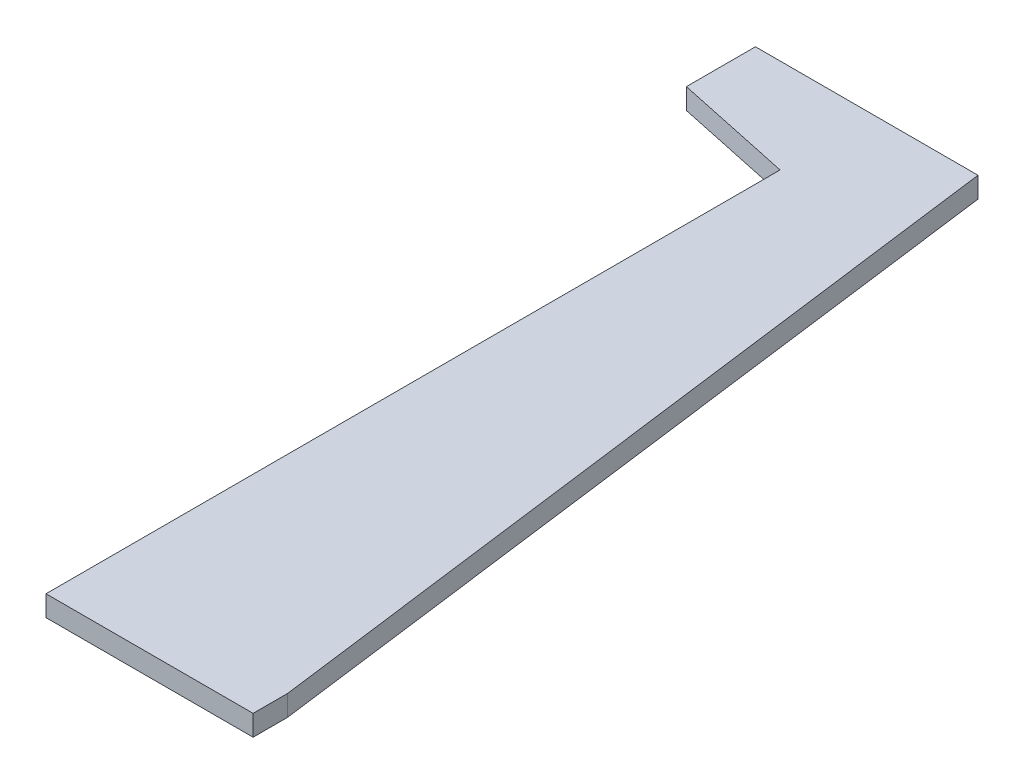
ISO-10303-21;
HEADER;
FILE_DESCRIPTION(('STEP AP214'),'2;1');
FILE_NAME('part.step','',(''),(''),'','','');
FILE_SCHEMA(('AUTOMOTIVE_DESIGN { 1 0 10303 214 1 1 1 1 }'));
ENDSEC;
DATA;
#1=APPLICATION_CONTEXT('core data for automotive mechanical design processes');
#2=APPLICATION_PROTOCOL_DEFINITION('international standard','automotive_design',2000,#1);
#3=PRODUCT_CONTEXT('',#1,'mechanical');
#4=PRODUCT('Part','Part','',(#3));
#5=PRODUCT_RELATED_PRODUCT_CATEGORY('part','',(#4));
#6=PRODUCT_DEFINITION_FORMATION('','',#4);
#7=PRODUCT_DEFINITION_CONTEXT('part definition',#1,'design');
#8=PRODUCT_DEFINITION('design','',#6,#7);
#9=PRODUCT_DEFINITION_SHAPE('','',#8);
#10=(LENGTH_UNIT() NAMED_UNIT(*) SI_UNIT(.MILLI.,.METRE.));
#11=(NAMED_UNIT(*) PLANE_ANGLE_UNIT() SI_UNIT($,.RADIAN.));
#12=(NAMED_UNIT(*) SI_UNIT($,.STERADIAN.) SOLID_ANGLE_UNIT());
#13=UNCERTAINTY_MEASURE_WITH_UNIT(LENGTH_MEASURE(1.E-05),#10,'distance_accuracy_value','');
#14=(GEOMETRIC_REPRESENTATION_CONTEXT(3) GLOBAL_UNCERTAINTY_ASSIGNED_CONTEXT((#13)) GLOBAL_UNIT_ASSIGNED_CONTEXT((#10,
#11,#12)) REPRESENTATION_CONTEXT('',''));
#15=CARTESIAN_POINT('',(0.,0.,0.));
#16=DIRECTION('',(0.,0.,1.));
#17=DIRECTION('',(1.,0.,0.));
#18=AXIS2_PLACEMENT_3D('',#15,#16,#17);
#19=CARTESIAN_POINT('',(0.,3.,0.));
#20=DIRECTION('',(0.,0.,-1.));
#21=DIRECTION('',(-1.,0.,0.));
#22=AXIS2_PLACEMENT_3D('',#19,#20,#21);
#23=PLANE('',#22);
#24=DIRECTION('',(1.,0.,0.));
#25=VECTOR('',#24,1.);
#26=CARTESIAN_POINT('',(0.,0.,0.));
#27=LINE('',#26,#25);
#28=CARTESIAN_POINT('',(0.,0.,0.));
#29=VERTEX_POINT('',#28);
#30=CARTESIAN_POINT('',(30.,0.,0.));
#31=VERTEX_POINT('',#30);
#32=EDGE_CURVE('E129',#29,#31,#27,.T.);
#33=ORIENTED_EDGE('',*,*,#32,.T.);
#34=DIRECTION('',(0.,-1.,0.));
#35=VECTOR('',#34,1.);
#36=CARTESIAN_POINT('',(30.,3.,0.));
#37=LINE('',#36,#35);
#38=CARTESIAN_POINT('',(30.,3.,0.));
#39=VERTEX_POINT('',#38);
#40=EDGE_CURVE('E11',#39,#31,#37,.T.);
#41=ORIENTED_EDGE('',*,*,#40,.F.);
#42=DIRECTION('',(1.,0.,0.));
#43=VECTOR('',#42,1.);
#44=CARTESIAN_POINT('',(0.,3.,0.));
#45=LINE('',#44,#43);
#46=CARTESIAN_POINT('',(0.,3.,0.));
#47=VERTEX_POINT('',#46);
#48=EDGE_CURVE('E142',#47,#39,#45,.T.);
#49=ORIENTED_EDGE('',*,*,#48,.F.);
#50=DIRECTION('',(0.,-1.,0.));
#51=VECTOR('',#50,1.);
#52=CARTESIAN_POINT('',(0.,3.,0.));
#53=LINE('',#52,#51);
#54=EDGE_CURVE('E125',#47,#29,#53,.T.);
#55=ORIENTED_EDGE('',*,*,#54,.T.);
#56=EDGE_LOOP('',(#33,#41,#49,#55));
#57=FACE_BOUND('',#56,.T.);
#58=ADVANCED_FACE('F39',(#57),#23,.F.);
#59=CARTESIAN_POINT('',(30.,3.,0.));
#60=DIRECTION('',(-1.,0.,0.));
#61=DIRECTION('',(0.,0.,1.));
#62=AXIS2_PLACEMENT_3D('',#59,#60,#61);
#63=PLANE('',#62);
#64=DIRECTION('',(0.,0.,-1.));
#65=VECTOR('',#64,1.);
#66=CARTESIAN_POINT('',(30.,0.,0.));
#67=LINE('',#66,#65);
#68=CARTESIAN_POINT('',(30.,0.,-5.));
#69=VERTEX_POINT('',#68);
#70=EDGE_CURVE('E132',#31,#69,#67,.T.);
#71=ORIENTED_EDGE('',*,*,#70,.T.);
#72=DIRECTION('',(0.,-1.,0.));
#73=VECTOR('',#72,1.);
#74=CARTESIAN_POINT('',(30.,3.,-5.));
#75=LINE('',#74,#73);
#76=CARTESIAN_POINT('',(30.,3.,-5.));
#77=VERTEX_POINT('',#76);
#78=EDGE_CURVE('E47',#77,#69,#75,.T.);
#79=ORIENTED_EDGE('',*,*,#78,.F.);
#80=DIRECTION('',(0.,0.,-1.));
#81=VECTOR('',#80,1.);
#82=CARTESIAN_POINT('',(30.,3.,0.));
#83=LINE('',#82,#81);
#84=EDGE_CURVE('E95',#39,#77,#83,.T.);
#85=ORIENTED_EDGE('',*,*,#84,.F.);
#86=ORIENTED_EDGE('',*,*,#40,.T.);
#87=EDGE_LOOP('',(#71,#79,#85,#86));
#88=FACE_BOUND('',#87,.T.);
#89=ADVANCED_FACE('F166',(#88),#63,.F.);
#90=CARTESIAN_POINT('',(15.,3.,-120.));
#91=DIRECTION('',(-0.991600411186222,0.,0.129339184067768));
#92=DIRECTION('',(0.129339184067768,0.,0.991600411186222));
#93=AXIS2_PLACEMENT_3D('',#90,#91,#92);
#94=PLANE('',#93);
#95=DIRECTION('',(-0.129339184067768,0.,-0.991600411186222));
#96=VECTOR('',#95,1.);
#97=CARTESIAN_POINT('',(15.,0.,-120.));
#98=LINE('',#97,#96);
#99=CARTESIAN_POINT('',(15.,0.,-120.));
#100=VERTEX_POINT('',#99);
#101=EDGE_CURVE('E134',#69,#100,#98,.T.);
#102=ORIENTED_EDGE('',*,*,#101,.T.);
#103=DIRECTION('',(0.,-1.,0.));
#104=VECTOR('',#103,1.);
#105=CARTESIAN_POINT('',(15.,3.,-120.));
#106=LINE('',#105,#104);
#107=CARTESIAN_POINT('',(15.,3.,-120.));
#108=VERTEX_POINT('',#107);
#109=EDGE_CURVE('E146',#108,#100,#106,.T.);
#110=ORIENTED_EDGE('',*,*,#109,.F.);
#111=DIRECTION('',(-0.129339184067768,0.,-0.991600411186222));
#112=VECTOR('',#111,1.);
#113=CARTESIAN_POINT('',(15.,3.,-120.));
#114=LINE('',#113,#112);
#115=EDGE_CURVE('E154',#77,#108,#114,.T.);
#116=ORIENTED_EDGE('',*,*,#115,.F.);
#117=ORIENTED_EDGE('',*,*,#78,.T.);
#118=EDGE_LOOP('',(#102,#110,#116,#117));
#119=FACE_BOUND('',#118,.T.);
#120=ADVANCED_FACE('F152',(#119),#94,.F.);
#121=CARTESIAN_POINT('',(0.,3.,-120.));
#122=DIRECTION('',(0.,0.,1.));
#123=DIRECTION('',(1.,0.,0.));
#124=AXIS2_PLACEMENT_3D('',#121,#122,#123);
#125=PLANE('',#124);
#126=DIRECTION('',(-1.,0.,0.));
#127=VECTOR('',#126,1.);
#128=CARTESIAN_POINT('',(0.,0.,-120.));
#129=LINE('',#128,#127);
#130=CARTESIAN_POINT('',(-17.2366669596938,0.,-120.));
#131=VERTEX_POINT('',#130);
#132=EDGE_CURVE('E137',#100,#131,#129,.T.);
#133=ORIENTED_EDGE('',*,*,#132,.T.);
#134=DIRECTION('',(0.,-1.,0.));
#135=VECTOR('',#134,1.);
#136=CARTESIAN_POINT('',(-17.2366669596938,3.,-120.));
#137=LINE('',#136,#135);
#138=CARTESIAN_POINT('',(-17.2366669596938,3.,-120.));
#139=VERTEX_POINT('',#138);
#140=EDGE_CURVE('E120',#139,#131,#137,.T.);
#141=ORIENTED_EDGE('',*,*,#140,.F.);
#142=DIRECTION('',(-1.,0.,0.));
#143=VECTOR('',#142,1.);
#144=CARTESIAN_POINT('',(0.,3.,-120.));
#145=LINE('',#144,#143);
#146=EDGE_CURVE('E111',#108,#139,#145,.T.);
#147=ORIENTED_EDGE('',*,*,#146,.F.);
#148=ORIENTED_EDGE('',*,*,#109,.T.);
#149=EDGE_LOOP('',(#133,#141,#147,#148));
#150=FACE_BOUND('',#149,.T.);
#151=ADVANCED_FACE('F159',(#150),#125,.F.);
#152=CARTESIAN_POINT('',(-17.2366669596938,3.,-120.));
#153=DIRECTION('',(1.,0.,0.));
#154=DIRECTION('',(0.,0.,-1.));
#155=AXIS2_PLACEMENT_3D('',#152,#153,#154);
#156=PLANE('',#155);
#157=DIRECTION('',(0.,0.,1.));
#158=VECTOR('',#157,1.);
#159=CARTESIAN_POINT('',(-17.2366669596938,0.,-120.));
#160=LINE('',#159,#158);
#161=CARTESIAN_POINT('',(-17.2366669596938,0.,-110.));
#162=VERTEX_POINT('',#161);
#163=EDGE_CURVE('E119',#131,#162,#160,.T.);
#164=ORIENTED_EDGE('',*,*,#163,.T.);
#165=DIRECTION('',(0.,-1.,0.));
#166=VECTOR('',#165,1.);
#167=CARTESIAN_POINT('',(-17.2366669596938,3.,-110.));
#168=LINE('',#167,#166);
#169=CARTESIAN_POINT('',(-17.2366669596938,3.,-110.));
#170=VERTEX_POINT('',#169);
#171=EDGE_CURVE('E116',#170,#162,#168,.T.);
#172=ORIENTED_EDGE('',*,*,#171,.F.);
#173=DIRECTION('',(0.,0.,1.));
#174=VECTOR('',#173,1.);
#175=CARTESIAN_POINT('',(-17.2366669596938,3.,-120.));
#176=LINE('',#175,#174);
#177=EDGE_CURVE('E105',#139,#170,#176,.T.);
#178=ORIENTED_EDGE('',*,*,#177,.F.);
#179=ORIENTED_EDGE('',*,*,#140,.T.);
#180=EDGE_LOOP('',(#164,#172,#178,#179));
#181=FACE_BOUND('',#180,.T.);
#182=ADVANCED_FACE('F117',(#181),#156,.F.);
#183=CARTESIAN_POINT('',(-17.2366669596938,3.,-110.));
#184=DIRECTION('',(0.208230685133804,0.,-0.978079742029609));
#185=DIRECTION('',(-0.978079742029609,0.,-0.208230685133804));
#186=AXIS2_PLACEMENT_3D('',#183,#184,#185);
#187=PLANE('',#186);
#188=DIRECTION('',(0.978079742029609,0.,0.208230685133804));
#189=VECTOR('',#188,1.);
#190=CARTESIAN_POINT('',(-17.2366669596938,0.,-110.));
#191=LINE('',#190,#189);
#192=CARTESIAN_POINT('',(0.,0.,-106.330357519733));
#193=VERTEX_POINT('',#192);
#194=EDGE_CURVE('E81',#162,#193,#191,.T.);
#195=ORIENTED_EDGE('',*,*,#194,.T.);
#196=DIRECTION('',(0.,-1.,0.));
#197=VECTOR('',#196,1.);
#198=CARTESIAN_POINT('',(0.,3.,-106.330357519733));
#199=LINE('',#198,#197);
#200=CARTESIAN_POINT('',(0.,3.,-106.330357519733));
#201=VERTEX_POINT('',#200);
#202=EDGE_CURVE('E121',#201,#193,#199,.T.);
#203=ORIENTED_EDGE('',*,*,#202,.F.);
#204=DIRECTION('',(0.978079742029609,0.,0.208230685133804));
#205=VECTOR('',#204,1.);
#206=CARTESIAN_POINT('',(-17.2366669596938,3.,-110.));
#207=LINE('',#206,#205);
#208=EDGE_CURVE('E109',#170,#201,#207,.T.);
#209=ORIENTED_EDGE('',*,*,#208,.F.);
#210=ORIENTED_EDGE('',*,*,#171,.T.);
#211=EDGE_LOOP('',(#195,#203,#209,#210));
#212=FACE_BOUND('',#211,.T.);
#213=ADVANCED_FACE('F123',(#212),#187,.F.);
#214=CARTESIAN_POINT('',(0.,3.,0.));
#215=DIRECTION('',(1.,0.,0.));
#216=DIRECTION('',(0.,0.,-1.));
#217=AXIS2_PLACEMENT_3D('',#214,#215,#216);
#218=PLANE('',#217);
#219=DIRECTION('',(0.,0.,1.));
#220=VECTOR('',#219,1.);
#221=CARTESIAN_POINT('',(0.,0.,0.));
#222=LINE('',#221,#220);
#223=EDGE_CURVE('E87',#193,#29,#222,.T.);
#224=ORIENTED_EDGE('',*,*,#223,.T.);
#225=ORIENTED_EDGE('',*,*,#54,.F.);
#226=DIRECTION('',(0.,0.,1.));
#227=VECTOR('',#226,1.);
#228=CARTESIAN_POINT('',(0.,3.,0.));
#229=LINE('',#228,#227);
#230=EDGE_CURVE('E55',#201,#47,#229,.T.);
#231=ORIENTED_EDGE('',*,*,#230,.F.);
#232=ORIENTED_EDGE('',*,*,#202,.T.);
#233=EDGE_LOOP('',(#224,#225,#231,#232));
#234=FACE_BOUND('',#233,.T.);
#235=ADVANCED_FACE('F180',(#234),#218,.F.);
#236=CARTESIAN_POINT('',(0.,3.,0.));
#237=DIRECTION('',(0.,1.,0.));
#238=DIRECTION('',(0.,0.,1.));
#239=AXIS2_PLACEMENT_3D('',#236,#237,#238);
#240=PLANE('',#239);
#241=ORIENTED_EDGE('',*,*,#48,.T.);
#242=ORIENTED_EDGE('',*,*,#84,.T.);
#243=ORIENTED_EDGE('',*,*,#115,.T.);
#244=ORIENTED_EDGE('',*,*,#146,.T.);
#245=ORIENTED_EDGE('',*,*,#177,.T.);
#246=ORIENTED_EDGE('',*,*,#208,.T.);
#247=ORIENTED_EDGE('',*,*,#230,.T.);
#248=EDGE_LOOP('',(#241,#242,#243,#244,#245,#246,#247));
#249=FACE_BOUND('',#248,.T.);
#250=ADVANCED_FACE('F107',(#249),#240,.T.);
#251=CARTESIAN_POINT('',(0.,0.,0.));
#252=DIRECTION('',(0.,1.,0.));
#253=DIRECTION('',(0.,0.,1.));
#254=AXIS2_PLACEMENT_3D('',#251,#252,#253);
#255=PLANE('',#254);
#256=ORIENTED_EDGE('',*,*,#32,.F.);
#257=ORIENTED_EDGE('',*,*,#223,.F.);
#258=ORIENTED_EDGE('',*,*,#194,.F.);
#259=ORIENTED_EDGE('',*,*,#163,.F.);
#260=ORIENTED_EDGE('',*,*,#132,.F.);
#261=ORIENTED_EDGE('',*,*,#101,.F.);
#262=ORIENTED_EDGE('',*,*,#70,.F.);
#263=EDGE_LOOP('',(#256,#257,#258,#259,#260,#261,#262));
#264=FACE_BOUND('',#263,.T.);
#265=ADVANCED_FACE('F157',(#264),#255,.F.);
#266=CLOSED_SHELL('',(#58,#89,#120,#151,#182,#213,#235,#250,#265));
#267=MANIFOLD_SOLID_BREP('B2',#266);
#268=ADVANCED_BREP_SHAPE_REPRESENTATION('',(#18,#267),#14);
#269=SHAPE_DEFINITION_REPRESENTATION(#9,#268);
ENDSEC;
END-ISO-10303-21;
